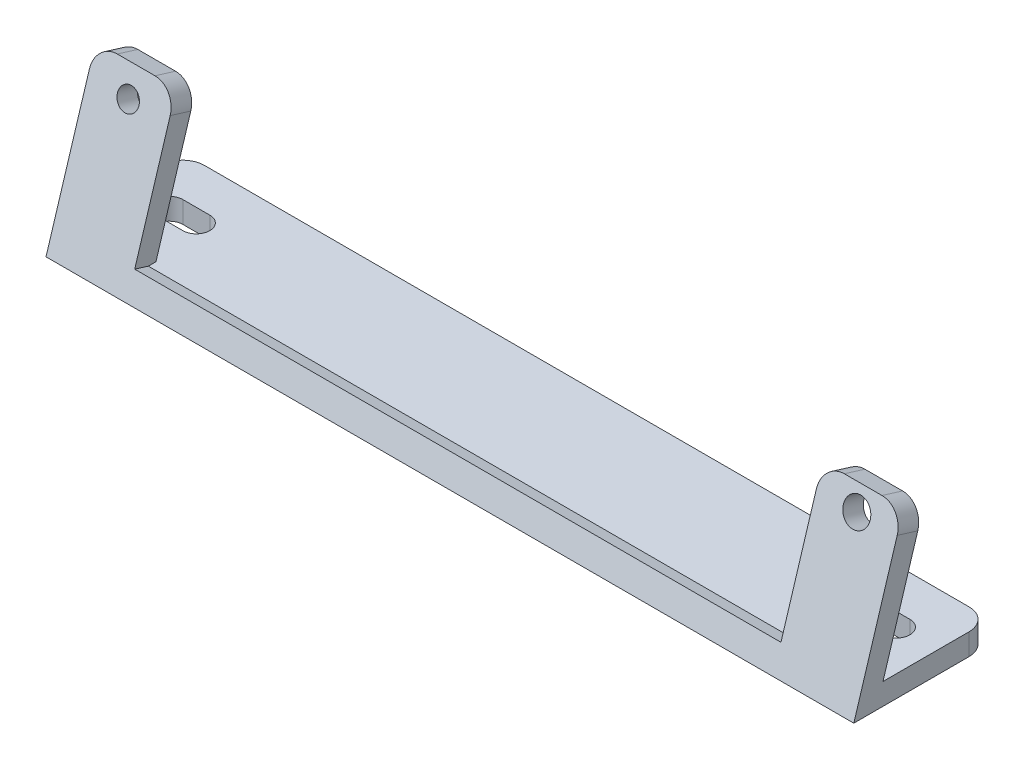
ISO-10303-21;
HEADER;
FILE_DESCRIPTION(('STEP AP214'),'2;1');
FILE_NAME('part.step','',(''),(''),'','','');
FILE_SCHEMA(('AUTOMOTIVE_DESIGN { 1 0 10303 214 1 1 1 1 }'));
ENDSEC;
DATA;
#1=APPLICATION_CONTEXT('core data for automotive mechanical design processes');
#2=APPLICATION_PROTOCOL_DEFINITION('international standard','automotive_design',2000,#1);
#3=PRODUCT_CONTEXT('',#1,'mechanical');
#4=PRODUCT('Part','Part','',(#3));
#5=PRODUCT_RELATED_PRODUCT_CATEGORY('part','',(#4));
#6=PRODUCT_DEFINITION_FORMATION('','',#4);
#7=PRODUCT_DEFINITION_CONTEXT('part definition',#1,'design');
#8=PRODUCT_DEFINITION('design','',#6,#7);
#9=PRODUCT_DEFINITION_SHAPE('','',#8);
#10=(LENGTH_UNIT() NAMED_UNIT(*) SI_UNIT(.MILLI.,.METRE.));
#11=(NAMED_UNIT(*) PLANE_ANGLE_UNIT() SI_UNIT($,.RADIAN.));
#12=(NAMED_UNIT(*) SI_UNIT($,.STERADIAN.) SOLID_ANGLE_UNIT());
#13=UNCERTAINTY_MEASURE_WITH_UNIT(LENGTH_MEASURE(1.E-05),#10,'distance_accuracy_value','');
#14=(GEOMETRIC_REPRESENTATION_CONTEXT(3) GLOBAL_UNCERTAINTY_ASSIGNED_CONTEXT((#13)) GLOBAL_UNIT_ASSIGNED_CONTEXT((#10,
#11,#12)) REPRESENTATION_CONTEXT('',''));
#15=CARTESIAN_POINT('',(0.,0.,0.));
#16=DIRECTION('',(0.,0.,1.));
#17=DIRECTION('',(1.,0.,0.));
#18=AXIS2_PLACEMENT_3D('',#15,#16,#17);
#19=CARTESIAN_POINT('',(-107.718631509355,30.,6.18161929623059));
#20=DIRECTION('',(0.,0.95574168052294,-0.294207138103728));
#21=DIRECTION('',(0.,0.294207138103728,0.95574168052294));
#22=AXIS2_PLACEMENT_3D('',#19,#20,#21);
#23=PLANE('',#22);
#24=DIRECTION('',(1.,0.,0.));
#25=VECTOR('',#24,1.);
#26=CARTESIAN_POINT('',(-107.718631509355,28.8231714475851,2.35865257413883));
#27=LINE('',#26,#25);
#28=CARTESIAN_POINT('',(-71.,28.8231714475851,2.35865257413883));
#29=VERTEX_POINT('',#28);
#30=CARTESIAN_POINT('',(-64.,28.8231714475851,2.35865257413883));
#31=VERTEX_POINT('',#30);
#32=EDGE_CURVE('E354',#29,#31,#27,.T.);
#33=ORIENTED_EDGE('',*,*,#32,.F.);
#34=DIRECTION('',(0.,-0.294207138103728,-0.95574168052294));
#35=VECTOR('',#34,1.);
#36=CARTESIAN_POINT('',(-71.,30.,6.18161929623059));
#37=LINE('',#36,#35);
#38=CARTESIAN_POINT('',(-71.,30.,6.18161929623059));
#39=VERTEX_POINT('',#38);
#40=EDGE_CURVE('E48',#29,#39,#37,.F.);
#41=ORIENTED_EDGE('',*,*,#40,.T.);
#42=DIRECTION('',(1.,0.,0.));
#43=VECTOR('',#42,1.);
#44=CARTESIAN_POINT('',(-107.718631509355,30.,6.18161929623059));
#45=LINE('',#44,#43);
#46=CARTESIAN_POINT('',(-64.,30.,6.18161929623059));
#47=VERTEX_POINT('',#46);
#48=EDGE_CURVE('E349',#39,#47,#45,.T.);
#49=ORIENTED_EDGE('',*,*,#48,.T.);
#50=DIRECTION('',(0.,0.294207138103728,0.95574168052294));
#51=VECTOR('',#50,1.);
#52=CARTESIAN_POINT('',(-64.,28.8231714475851,2.35865257413883));
#53=LINE('',#52,#51);
#54=EDGE_CURVE('E471',#47,#31,#53,.F.);
#55=ORIENTED_EDGE('',*,*,#54,.T.);
#56=EDGE_LOOP('',(#33,#41,#49,#55));
#57=FACE_BOUND('',#56,.T.);
#58=ADVANCED_FACE('F39',(#57),#23,.T.);
#59=CARTESIAN_POINT('',(-107.718631509355,28.8231714475851,2.35865257413883));
#60=DIRECTION('',(0.,-0.294207138103729,-0.95574168052294));
#61=DIRECTION('',(0.,0.95574168052294,-0.294207138103729));
#62=AXIS2_PLACEMENT_3D('',#59,#60,#61);
#63=PLANE('',#62);
#64=CARTESIAN_POINT('',(-67.5,24.0444630449704,3.82968826465747));
#65=DIRECTION('',(0.,-0.294207138103729,-0.95574168052294));
#66=DIRECTION('',(0.,0.95574168052294,-0.294207138103729));
#67=AXIS2_PLACEMENT_3D('',#64,#65,#66);
#68=CIRCLE('',#67,2.005);
#69=CARTESIAN_POINT('',(-67.5,25.9607251144189,3.23980295275949));
#70=VERTEX_POINT('',#69);
#71=EDGE_CURVE('E329',#70,#70,#68,.T.);
#72=ORIENTED_EDGE('',*,*,#71,.F.);
#73=EDGE_LOOP('',(#72));
#74=FACE_BOUND('',#73,.T.);
#75=DIRECTION('',(0.,-0.95574168052294,0.294207138103729));
#76=VECTOR('',#75,1.);
#77=CARTESIAN_POINT('',(-75.,28.8231714475851,2.35865257413883));
#78=LINE('',#77,#76);
#79=CARTESIAN_POINT('',(-75.,25.0002047254933,3.53548112655374));
#80=VERTEX_POINT('',#79);
#81=CARTESIAN_POINT('',(-75.,4.,10.));
#82=VERTEX_POINT('',#81);
#83=EDGE_CURVE('E335',#80,#82,#78,.T.);
#84=ORIENTED_EDGE('',*,*,#83,.F.);
#85=CARTESIAN_POINT('',(-71.,25.0002047254933,3.53548112655374));
#86=DIRECTION('',(0.,-0.294207138103729,-0.95574168052294));
#87=DIRECTION('',(0.,0.95574168052294,-0.294207138103729));
#88=AXIS2_PLACEMENT_3D('',#85,#86,#87);
#89=CIRCLE('',#88,4.);
#90=EDGE_CURVE('E468',#80,#29,#89,.T.);
#91=ORIENTED_EDGE('',*,*,#90,.T.);
#92=ORIENTED_EDGE('',*,*,#32,.T.);
#93=CARTESIAN_POINT('',(-64.,25.0002047254933,3.53548112655374));
#94=DIRECTION('',(0.,-0.294207138103729,-0.95574168052294));
#95=DIRECTION('',(0.,0.95574168052294,-0.294207138103729));
#96=AXIS2_PLACEMENT_3D('',#93,#94,#95);
#97=CIRCLE('',#96,4.);
#98=CARTESIAN_POINT('',(-60.,25.0002047254933,3.53548112655374));
#99=VERTEX_POINT('',#98);
#100=EDGE_CURVE('E465',#31,#99,#97,.T.);
#101=ORIENTED_EDGE('',*,*,#100,.T.);
#102=DIRECTION('',(0.,0.95574168052294,-0.294207138103729));
#103=VECTOR('',#102,1.);
#104=CARTESIAN_POINT('',(-60.,28.8231714475851,2.35865257413883));
#105=LINE('',#104,#103);
#106=CARTESIAN_POINT('',(-60.,4.,10.));
#107=VERTEX_POINT('',#106);
#108=EDGE_CURVE('E392',#107,#99,#105,.T.);
#109=ORIENTED_EDGE('',*,*,#108,.F.);
#110=DIRECTION('',(1.,0.,0.));
#111=VECTOR('',#110,1.);
#112=CARTESIAN_POINT('',(-75.,4.,10.));
#113=LINE('',#112,#111);
#114=EDGE_CURVE('E375',#82,#107,#113,.T.);
#115=ORIENTED_EDGE('',*,*,#114,.F.);
#116=EDGE_LOOP('',(#84,#91,#92,#101,#109,#115));
#117=FACE_BOUND('',#116,.T.);
#118=ADVANCED_FACE('F494',(#74,#117),#63,.T.);
#119=CARTESIAN_POINT('',(0.,4.,0.));
#120=DIRECTION('',(0.,1.,0.));
#121=DIRECTION('',(0.,0.,1.));
#122=AXIS2_PLACEMENT_3D('',#119,#120,#121);
#123=PLANE('',#122);
#124=CARTESIAN_POINT('',(-62.5,4.,0.));
#125=DIRECTION('',(0.,1.,0.));
#126=DIRECTION('',(0.,0.,1.));
#127=AXIS2_PLACEMENT_3D('',#124,#125,#126);
#128=CIRCLE('',#127,2.5);
#129=CARTESIAN_POINT('',(-62.5,4.,2.5));
#130=VERTEX_POINT('',#129);
#131=CARTESIAN_POINT('',(-62.5,4.,-2.5));
#132=VERTEX_POINT('',#131);
#133=EDGE_CURVE('E291',#130,#132,#128,.T.);
#134=ORIENTED_EDGE('',*,*,#133,.F.);
#135=DIRECTION('',(1.,0.,0.));
#136=VECTOR('',#135,1.);
#137=CARTESIAN_POINT('',(0.,4.,2.50000000000002));
#138=LINE('',#137,#136);
#139=CARTESIAN_POINT('',(-67.5,4.,2.5));
#140=VERTEX_POINT('',#139);
#141=EDGE_CURVE('E283',#140,#130,#138,.T.);
#142=ORIENTED_EDGE('',*,*,#141,.F.);
#143=CARTESIAN_POINT('',(-67.5,4.,0.));
#144=DIRECTION('',(0.,1.,0.));
#145=DIRECTION('',(0.,0.,1.));
#146=AXIS2_PLACEMENT_3D('',#143,#144,#145);
#147=CIRCLE('',#146,2.5);
#148=CARTESIAN_POINT('',(-67.5,4.,-2.5));
#149=VERTEX_POINT('',#148);
#150=EDGE_CURVE('E212',#149,#140,#147,.T.);
#151=ORIENTED_EDGE('',*,*,#150,.F.);
#152=DIRECTION('',(-1.,0.,0.));
#153=VECTOR('',#152,1.);
#154=CARTESIAN_POINT('',(0.,4.,-2.49999999999999));
#155=LINE('',#154,#153);
#156=EDGE_CURVE('E288',#132,#149,#155,.T.);
#157=ORIENTED_EDGE('',*,*,#156,.F.);
#158=EDGE_LOOP('',(#134,#142,#151,#157));
#159=FACE_BOUND('',#158,.T.);
#160=CARTESIAN_POINT('',(62.5,4.,0.));
#161=DIRECTION('',(0.,1.,0.));
#162=DIRECTION('',(0.,0.,1.));
#163=AXIS2_PLACEMENT_3D('',#160,#161,#162);
#164=CIRCLE('',#163,2.5);
#165=CARTESIAN_POINT('',(62.5,4.,-2.5));
#166=VERTEX_POINT('',#165);
#167=CARTESIAN_POINT('',(62.5,4.,2.5));
#168=VERTEX_POINT('',#167);
#169=EDGE_CURVE('E280',#166,#168,#164,.T.);
#170=ORIENTED_EDGE('',*,*,#169,.F.);
#171=DIRECTION('',(-1.,0.,0.));
#172=VECTOR('',#171,1.);
#173=CARTESIAN_POINT('',(0.,4.,-2.50000000000001));
#174=LINE('',#173,#172);
#175=CARTESIAN_POINT('',(67.5,4.,-2.5));
#176=VERTEX_POINT('',#175);
#177=EDGE_CURVE('E241',#176,#166,#174,.T.);
#178=ORIENTED_EDGE('',*,*,#177,.F.);
#179=CARTESIAN_POINT('',(67.5,4.,0.));
#180=DIRECTION('',(0.,1.,0.));
#181=DIRECTION('',(0.,0.,1.));
#182=AXIS2_PLACEMENT_3D('',#179,#180,#181);
#183=CIRCLE('',#182,2.5);
#184=CARTESIAN_POINT('',(67.5,4.,2.5));
#185=VERTEX_POINT('',#184);
#186=EDGE_CURVE('E274',#185,#176,#183,.T.);
#187=ORIENTED_EDGE('',*,*,#186,.F.);
#188=DIRECTION('',(1.,0.,0.));
#189=VECTOR('',#188,1.);
#190=CARTESIAN_POINT('',(0.,4.,2.49999999999999));
#191=LINE('',#190,#189);
#192=EDGE_CURVE('E277',#168,#185,#191,.T.);
#193=ORIENTED_EDGE('',*,*,#192,.F.);
#194=EDGE_LOOP('',(#170,#178,#187,#193));
#195=FACE_BOUND('',#194,.T.);
#196=CARTESIAN_POINT('',(-71.,4.,-6.));
#197=DIRECTION('',(0.,1.,0.));
#198=DIRECTION('',(0.,0.,1.));
#199=AXIS2_PLACEMENT_3D('',#196,#197,#198);
#200=CIRCLE('',#199,4.);
#201=CARTESIAN_POINT('',(-71.,4.,-10.));
#202=VERTEX_POINT('',#201);
#203=CARTESIAN_POINT('',(-75.,4.,-6.));
#204=VERTEX_POINT('',#203);
#205=EDGE_CURVE('E426',#202,#204,#200,.T.);
#206=ORIENTED_EDGE('',*,*,#205,.T.);
#207=DIRECTION('',(0.,0.,1.));
#208=VECTOR('',#207,1.);
#209=CARTESIAN_POINT('',(-75.,4.,-10.));
#210=LINE('',#209,#208);
#211=EDGE_CURVE('E371',#204,#82,#210,.T.);
#212=ORIENTED_EDGE('',*,*,#211,.T.);
#213=ORIENTED_EDGE('',*,*,#114,.T.);
#214=DIRECTION('',(0.,0.,-1.));
#215=VECTOR('',#214,1.);
#216=CARTESIAN_POINT('',(-60.,4.,-3.37579750899881));
#217=LINE('',#216,#215);
#218=CARTESIAN_POINT('',(-60.,4.,11.4158603734888));
#219=VERTEX_POINT('',#218);
#220=EDGE_CURVE('E294',#219,#107,#217,.T.);
#221=ORIENTED_EDGE('',*,*,#220,.F.);
#222=DIRECTION('',(-1.,0.,0.));
#223=VECTOR('',#222,1.);
#224=CARTESIAN_POINT('',(-60.,4.,11.4158603734888));
#225=LINE('',#224,#223);
#226=CARTESIAN_POINT('',(60.,4.,11.4158603734888));
#227=VERTEX_POINT('',#226);
#228=EDGE_CURVE('E300',#227,#219,#225,.T.);
#229=ORIENTED_EDGE('',*,*,#228,.F.);
#230=DIRECTION('',(0.,0.,1.));
#231=VECTOR('',#230,1.);
#232=CARTESIAN_POINT('',(60.,4.,-3.37579750899881));
#233=LINE('',#232,#231);
#234=CARTESIAN_POINT('',(60.,4.,10.));
#235=VERTEX_POINT('',#234);
#236=EDGE_CURVE('E295',#235,#227,#233,.T.);
#237=ORIENTED_EDGE('',*,*,#236,.F.);
#238=CARTESIAN_POINT('',(75.,4.,10.));
#239=VERTEX_POINT('',#238);
#240=EDGE_CURVE('E374',#235,#239,#113,.T.);
#241=ORIENTED_EDGE('',*,*,#240,.T.);
#242=DIRECTION('',(0.,0.,-1.));
#243=VECTOR('',#242,1.);
#244=CARTESIAN_POINT('',(75.,4.,-10.));
#245=LINE('',#244,#243);
#246=CARTESIAN_POINT('',(75.,4.,-6.));
#247=VERTEX_POINT('',#246);
#248=EDGE_CURVE('E362',#239,#247,#245,.T.);
#249=ORIENTED_EDGE('',*,*,#248,.T.);
#250=CARTESIAN_POINT('',(71.,4.,-6.));
#251=DIRECTION('',(0.,1.,0.));
#252=DIRECTION('',(0.,0.,1.));
#253=AXIS2_PLACEMENT_3D('',#250,#251,#252);
#254=CIRCLE('',#253,4.);
#255=CARTESIAN_POINT('',(71.,4.,-10.));
#256=VERTEX_POINT('',#255);
#257=EDGE_CURVE('E423',#247,#256,#254,.T.);
#258=ORIENTED_EDGE('',*,*,#257,.T.);
#259=DIRECTION('',(-1.,0.,0.));
#260=VECTOR('',#259,1.);
#261=CARTESIAN_POINT('',(-75.,4.,-10.));
#262=LINE('',#261,#260);
#263=EDGE_CURVE('E366',#256,#202,#262,.T.);
#264=ORIENTED_EDGE('',*,*,#263,.T.);
#265=EDGE_LOOP('',(#206,#212,#213,#221,#229,#237,#241,#249,#258,#264));
#266=FACE_BOUND('',#265,.T.);
#267=ADVANCED_FACE('F497',(#159,#195,#266),#123,.T.);
#268=CARTESIAN_POINT('',(0.,0.,0.));
#269=DIRECTION('',(0.,1.,0.));
#270=DIRECTION('',(0.,0.,1.));
#271=AXIS2_PLACEMENT_3D('',#268,#269,#270);
#272=PLANE('',#271);
#273=DIRECTION('',(-1.,0.,0.));
#274=VECTOR('',#273,1.);
#275=CARTESIAN_POINT('',(-62.5,0.,2.5));
#276=LINE('',#275,#274);
#277=CARTESIAN_POINT('',(-62.5,0.,2.5));
#278=VERTEX_POINT('',#277);
#279=CARTESIAN_POINT('',(-67.5,0.,2.5));
#280=VERTEX_POINT('',#279);
#281=EDGE_CURVE('E220',#278,#280,#276,.T.);
#282=ORIENTED_EDGE('',*,*,#281,.F.);
#283=CARTESIAN_POINT('',(-62.5,0.,0.));
#284=DIRECTION('',(0.,-1.,0.));
#285=DIRECTION('',(0.,0.,-1.));
#286=AXIS2_PLACEMENT_3D('',#283,#284,#285);
#287=CIRCLE('',#286,2.5);
#288=CARTESIAN_POINT('',(-62.5,0.,-2.5));
#289=VERTEX_POINT('',#288);
#290=EDGE_CURVE('E226',#289,#278,#287,.T.);
#291=ORIENTED_EDGE('',*,*,#290,.F.);
#292=DIRECTION('',(1.,0.,0.));
#293=VECTOR('',#292,1.);
#294=CARTESIAN_POINT('',(-62.5,0.,-2.5));
#295=LINE('',#294,#293);
#296=CARTESIAN_POINT('',(-67.5,0.,-2.5));
#297=VERTEX_POINT('',#296);
#298=EDGE_CURVE('E231',#297,#289,#295,.T.);
#299=ORIENTED_EDGE('',*,*,#298,.F.);
#300=CARTESIAN_POINT('',(-67.5,0.,0.));
#301=DIRECTION('',(0.,-1.,0.));
#302=DIRECTION('',(0.,0.,-1.));
#303=AXIS2_PLACEMENT_3D('',#300,#301,#302);
#304=CIRCLE('',#303,2.5);
#305=EDGE_CURVE('E209',#280,#297,#304,.T.);
#306=ORIENTED_EDGE('',*,*,#305,.F.);
#307=EDGE_LOOP('',(#282,#291,#299,#306));
#308=FACE_BOUND('',#307,.T.);
#309=DIRECTION('',(1.,0.,0.));
#310=VECTOR('',#309,1.);
#311=CARTESIAN_POINT('',(62.5,0.,-2.5));
#312=LINE('',#311,#310);
#313=CARTESIAN_POINT('',(62.5,0.,-2.5));
#314=VERTEX_POINT('',#313);
#315=CARTESIAN_POINT('',(67.5,0.,-2.5));
#316=VERTEX_POINT('',#315);
#317=EDGE_CURVE('E249',#314,#316,#312,.T.);
#318=ORIENTED_EDGE('',*,*,#317,.F.);
#319=CARTESIAN_POINT('',(62.5,0.,0.));
#320=DIRECTION('',(0.,-1.,0.));
#321=DIRECTION('',(0.,0.,-1.));
#322=AXIS2_PLACEMENT_3D('',#319,#320,#321);
#323=CIRCLE('',#322,2.5);
#324=CARTESIAN_POINT('',(62.5,0.,2.5));
#325=VERTEX_POINT('',#324);
#326=EDGE_CURVE('E246',#325,#314,#323,.T.);
#327=ORIENTED_EDGE('',*,*,#326,.F.);
#328=DIRECTION('',(-1.,0.,0.));
#329=VECTOR('',#328,1.);
#330=CARTESIAN_POINT('',(62.5,0.,2.5));
#331=LINE('',#330,#329);
#332=CARTESIAN_POINT('',(67.5,0.,2.5));
#333=VERTEX_POINT('',#332);
#334=EDGE_CURVE('E256',#333,#325,#331,.T.);
#335=ORIENTED_EDGE('',*,*,#334,.F.);
#336=CARTESIAN_POINT('',(67.5,0.,0.));
#337=DIRECTION('',(0.,-1.,0.));
#338=DIRECTION('',(0.,0.,-1.));
#339=AXIS2_PLACEMENT_3D('',#336,#337,#338);
#340=CIRCLE('',#339,2.5);
#341=EDGE_CURVE('E252',#316,#333,#340,.T.);
#342=ORIENTED_EDGE('',*,*,#341,.F.);
#343=EDGE_LOOP('',(#318,#327,#335,#342));
#344=FACE_BOUND('',#343,.T.);
#345=CARTESIAN_POINT('',(71.,0.,-6.));
#346=DIRECTION('',(0.,1.,0.));
#347=DIRECTION('',(0.,0.,1.));
#348=AXIS2_PLACEMENT_3D('',#345,#346,#347);
#349=CIRCLE('',#348,4.);
#350=CARTESIAN_POINT('',(71.,0.,-10.));
#351=VERTEX_POINT('',#350);
#352=CARTESIAN_POINT('',(75.,0.,-6.));
#353=VERTEX_POINT('',#352);
#354=EDGE_CURVE('E410',#351,#353,#349,.F.);
#355=ORIENTED_EDGE('',*,*,#354,.T.);
#356=DIRECTION('',(0.,0.,-1.));
#357=VECTOR('',#356,1.);
#358=CARTESIAN_POINT('',(75.,0.,-10.));
#359=LINE('',#358,#357);
#360=CARTESIAN_POINT('',(75.,0.,15.4165562284386));
#361=VERTEX_POINT('',#360);
#362=EDGE_CURVE('E361',#361,#353,#359,.T.);
#363=ORIENTED_EDGE('',*,*,#362,.F.);
#364=DIRECTION('',(1.,0.,0.));
#365=VECTOR('',#364,1.);
#366=CARTESIAN_POINT('',(-107.718631509355,0.,15.4165562284386));
#367=LINE('',#366,#365);
#368=CARTESIAN_POINT('',(-75.,0.,15.4165562284386));
#369=VERTEX_POINT('',#368);
#370=EDGE_CURVE('E336',#369,#361,#367,.T.);
#371=ORIENTED_EDGE('',*,*,#370,.F.);
#372=DIRECTION('',(0.,0.,1.));
#373=VECTOR('',#372,1.);
#374=CARTESIAN_POINT('',(-75.,0.,-10.));
#375=LINE('',#374,#373);
#376=CARTESIAN_POINT('',(-75.,0.,-6.));
#377=VERTEX_POINT('',#376);
#378=EDGE_CURVE('E367',#377,#369,#375,.T.);
#379=ORIENTED_EDGE('',*,*,#378,.F.);
#380=CARTESIAN_POINT('',(-71.,0.,-6.));
#381=DIRECTION('',(0.,1.,0.));
#382=DIRECTION('',(0.,0.,1.));
#383=AXIS2_PLACEMENT_3D('',#380,#381,#382);
#384=CIRCLE('',#383,4.);
#385=CARTESIAN_POINT('',(-71.,0.,-10.));
#386=VERTEX_POINT('',#385);
#387=EDGE_CURVE('E413',#377,#386,#384,.F.);
#388=ORIENTED_EDGE('',*,*,#387,.T.);
#389=DIRECTION('',(-1.,0.,0.));
#390=VECTOR('',#389,1.);
#391=CARTESIAN_POINT('',(-75.,0.,-10.));
#392=LINE('',#391,#390);
#393=EDGE_CURVE('E383',#351,#386,#392,.T.);
#394=ORIENTED_EDGE('',*,*,#393,.F.);
#395=EDGE_LOOP('',(#355,#363,#371,#379,#388,#394));
#396=FACE_BOUND('',#395,.T.);
#397=ADVANCED_FACE('F228',(#308,#344,#396),#272,.F.);
#398=CARTESIAN_POINT('',(75.,4.,-10.));
#399=DIRECTION('',(-1.,0.,0.));
#400=DIRECTION('',(0.,0.,1.));
#401=AXIS2_PLACEMENT_3D('',#398,#399,#400);
#402=PLANE('',#401);
#403=DIRECTION('',(0.,-0.95574168052294,0.294207138103729));
#404=VECTOR('',#403,1.);
#405=CARTESIAN_POINT('',(75.,0.,15.4165562284386));
#406=LINE('',#405,#404);
#407=CARTESIAN_POINT('',(75.,26.1770332779082,7.3584478486455));
#408=VERTEX_POINT('',#407);
#409=EDGE_CURVE('E341',#408,#361,#406,.T.);
#410=ORIENTED_EDGE('',*,*,#409,.T.);
#411=ORIENTED_EDGE('',*,*,#362,.T.);
#412=DIRECTION('',(0.,-1.,0.));
#413=VECTOR('',#412,1.);
#414=CARTESIAN_POINT('',(75.,4.,-6.));
#415=LINE('',#414,#413);
#416=EDGE_CURVE('E433',#353,#247,#415,.F.);
#417=ORIENTED_EDGE('',*,*,#416,.T.);
#418=ORIENTED_EDGE('',*,*,#248,.F.);
#419=DIRECTION('',(0.,0.95574168052294,-0.294207138103729));
#420=VECTOR('',#419,1.);
#421=CARTESIAN_POINT('',(75.,28.8231714475851,2.35865257413883));
#422=LINE('',#421,#420);
#423=CARTESIAN_POINT('',(75.,25.0002047254933,3.53548112655374));
#424=VERTEX_POINT('',#423);
#425=EDGE_CURVE('E337',#239,#424,#422,.T.);
#426=ORIENTED_EDGE('',*,*,#425,.T.);
#427=DIRECTION('',(0.,0.294207138103728,0.95574168052294));
#428=VECTOR('',#427,1.);
#429=CARTESIAN_POINT('',(75.,26.1770332779082,7.3584478486455));
#430=LINE('',#429,#428);
#431=EDGE_CURVE('E429',#424,#408,#430,.T.);
#432=ORIENTED_EDGE('',*,*,#431,.T.);
#433=EDGE_LOOP('',(#410,#411,#417,#418,#426,#432));
#434=FACE_BOUND('',#433,.T.);
#435=ADVANCED_FACE('F517',(#434),#402,.F.);
#436=CARTESIAN_POINT('',(-75.,4.,-10.));
#437=DIRECTION('',(0.,0.,1.));
#438=DIRECTION('',(1.,0.,0.));
#439=AXIS2_PLACEMENT_3D('',#436,#437,#438);
#440=PLANE('',#439);
#441=ORIENTED_EDGE('',*,*,#393,.T.);
#442=DIRECTION('',(0.,-1.,0.));
#443=VECTOR('',#442,1.);
#444=CARTESIAN_POINT('',(-71.,4.,-10.));
#445=LINE('',#444,#443);
#446=EDGE_CURVE('E420',#386,#202,#445,.F.);
#447=ORIENTED_EDGE('',*,*,#446,.T.);
#448=ORIENTED_EDGE('',*,*,#263,.F.);
#449=DIRECTION('',(0.,-1.,0.));
#450=VECTOR('',#449,1.);
#451=CARTESIAN_POINT('',(71.,4.,-10.));
#452=LINE('',#451,#450);
#453=EDGE_CURVE('E416',#256,#351,#452,.T.);
#454=ORIENTED_EDGE('',*,*,#453,.T.);
#455=EDGE_LOOP('',(#441,#447,#448,#454));
#456=FACE_BOUND('',#455,.T.);
#457=ADVANCED_FACE('F508',(#456),#440,.F.);
#458=CARTESIAN_POINT('',(-75.,4.,-10.));
#459=DIRECTION('',(1.,0.,0.));
#460=DIRECTION('',(0.,0.,-1.));
#461=AXIS2_PLACEMENT_3D('',#458,#459,#460);
#462=PLANE('',#461);
#463=ORIENTED_EDGE('',*,*,#83,.T.);
#464=ORIENTED_EDGE('',*,*,#211,.F.);
#465=DIRECTION('',(0.,-1.,0.));
#466=VECTOR('',#465,1.);
#467=CARTESIAN_POINT('',(-75.,4.,-6.));
#468=LINE('',#467,#466);
#469=EDGE_CURVE('E406',#204,#377,#468,.T.);
#470=ORIENTED_EDGE('',*,*,#469,.T.);
#471=ORIENTED_EDGE('',*,*,#378,.T.);
#472=DIRECTION('',(0.,0.95574168052294,-0.294207138103729));
#473=VECTOR('',#472,1.);
#474=CARTESIAN_POINT('',(-75.,0.,15.4165562284386));
#475=LINE('',#474,#473);
#476=CARTESIAN_POINT('',(-75.,26.1770332779082,7.3584478486455));
#477=VERTEX_POINT('',#476);
#478=EDGE_CURVE('E332',#369,#477,#475,.T.);
#479=ORIENTED_EDGE('',*,*,#478,.T.);
#480=DIRECTION('',(0.,-0.294207138103728,-0.95574168052294));
#481=VECTOR('',#480,1.);
#482=CARTESIAN_POINT('',(-75.,25.0002047254933,3.53548112655374));
#483=LINE('',#482,#481);
#484=EDGE_CURVE('E396',#477,#80,#483,.T.);
#485=ORIENTED_EDGE('',*,*,#484,.T.);
#486=EDGE_LOOP('',(#463,#464,#470,#471,#479,#485));
#487=FACE_BOUND('',#486,.T.);
#488=ADVANCED_FACE('F490',(#487),#462,.F.);
#489=CARTESIAN_POINT('',(-107.718631509355,0.,15.4165562284386));
#490=DIRECTION('',(0.,0.294207138103729,0.95574168052294));
#491=DIRECTION('',(0.,-0.95574168052294,0.294207138103729));
#492=AXIS2_PLACEMENT_3D('',#489,#490,#491);
#493=PLANE('',#492);
#494=CARTESIAN_POINT('',(-71.,26.1770332779082,7.3584478486455));
#495=DIRECTION('',(0.,0.294207138103729,0.95574168052294));
#496=DIRECTION('',(0.,-0.95574168052294,0.294207138103729));
#497=AXIS2_PLACEMENT_3D('',#494,#495,#496);
#498=CIRCLE('',#497,4.);
#499=EDGE_CURVE('E446',#39,#477,#498,.T.);
#500=ORIENTED_EDGE('',*,*,#499,.T.);
#501=ORIENTED_EDGE('',*,*,#478,.F.);
#502=ORIENTED_EDGE('',*,*,#370,.T.);
#503=ORIENTED_EDGE('',*,*,#409,.F.);
#504=CARTESIAN_POINT('',(71.,26.1770332779082,7.3584478486455));
#505=DIRECTION('',(0.,0.294207138103729,0.95574168052294));
#506=DIRECTION('',(0.,-0.95574168052294,0.294207138103729));
#507=AXIS2_PLACEMENT_3D('',#504,#505,#506);
#508=CIRCLE('',#507,4.);
#509=CARTESIAN_POINT('',(71.,30.,6.18161929623059));
#510=VERTEX_POINT('',#509);
#511=EDGE_CURVE('E450',#408,#510,#508,.T.);
#512=ORIENTED_EDGE('',*,*,#511,.T.);
#513=CARTESIAN_POINT('',(64.,30.,6.18161929623059));
#514=VERTEX_POINT('',#513);
#515=EDGE_CURVE('E353',#514,#510,#45,.T.);
#516=ORIENTED_EDGE('',*,*,#515,.F.);
#517=CARTESIAN_POINT('',(64.,26.1770332779082,7.3584478486455));
#518=DIRECTION('',(0.,0.294207138103729,0.95574168052294));
#519=DIRECTION('',(0.,-0.95574168052294,0.294207138103729));
#520=AXIS2_PLACEMENT_3D('',#517,#518,#519);
#521=CIRCLE('',#520,4.);
#522=CARTESIAN_POINT('',(60.,26.1770332779082,7.3584478486455));
#523=VERTEX_POINT('',#522);
#524=EDGE_CURVE('E453',#514,#523,#521,.T.);
#525=ORIENTED_EDGE('',*,*,#524,.T.);
#526=DIRECTION('',(0.,0.95574168052294,-0.294207138103729));
#527=VECTOR('',#526,1.);
#528=CARTESIAN_POINT('',(60.,30.,6.18161929623059));
#529=LINE('',#528,#527);
#530=CARTESIAN_POINT('',(60.,4.7787084026147,13.94552053792));
#531=VERTEX_POINT('',#530);
#532=EDGE_CURVE('E321',#531,#523,#529,.T.);
#533=ORIENTED_EDGE('',*,*,#532,.F.);
#534=DIRECTION('',(1.,0.,0.));
#535=VECTOR('',#534,1.);
#536=CARTESIAN_POINT('',(-60.,4.7787084026147,13.94552053792));
#537=LINE('',#536,#535);
#538=CARTESIAN_POINT('',(-60.,4.7787084026147,13.94552053792));
#539=VERTEX_POINT('',#538);
#540=EDGE_CURVE('E317',#539,#531,#537,.T.);
#541=ORIENTED_EDGE('',*,*,#540,.F.);
#542=DIRECTION('',(0.,-0.95574168052294,0.294207138103729));
#543=VECTOR('',#542,1.);
#544=CARTESIAN_POINT('',(-60.,30.,6.18161929623059));
#545=LINE('',#544,#543);
#546=CARTESIAN_POINT('',(-60.,26.1770332779082,7.3584478486455));
#547=VERTEX_POINT('',#546);
#548=EDGE_CURVE('E310',#547,#539,#545,.T.);
#549=ORIENTED_EDGE('',*,*,#548,.F.);
#550=CARTESIAN_POINT('',(-64.,26.1770332779082,7.3584478486455));
#551=DIRECTION('',(0.,0.294207138103729,0.95574168052294));
#552=DIRECTION('',(0.,-0.95574168052294,0.294207138103729));
#553=AXIS2_PLACEMENT_3D('',#550,#551,#552);
#554=CIRCLE('',#553,4.);
#555=EDGE_CURVE('E443',#547,#47,#554,.T.);
#556=ORIENTED_EDGE('',*,*,#555,.T.);
#557=ORIENTED_EDGE('',*,*,#48,.F.);
#558=EDGE_LOOP('',(#500,#501,#502,#503,#512,#516,#525,#533,#541,#549,#556,#557));
#559=FACE_BOUND('',#558,.T.);
#560=CARTESIAN_POINT('',(67.5,26.167475861103,7.36138992002654));
#561=DIRECTION('',(0.,0.294207138103729,0.95574168052294));
#562=DIRECTION('',(0.,-0.95574168052294,0.294207138103729));
#563=AXIS2_PLACEMENT_3D('',#560,#561,#562);
#564=CIRCLE('',#563,2.5);
#565=CARTESIAN_POINT('',(67.5,23.7781216597957,8.09690776528586));
#566=VERTEX_POINT('',#565);
#567=EDGE_CURVE('E299',#566,#566,#564,.T.);
#568=ORIENTED_EDGE('',*,*,#567,.F.);
#569=EDGE_LOOP('',(#568));
#570=FACE_BOUND('',#569,.T.);
#571=CARTESIAN_POINT('',(-67.5,25.2212915973853,7.65265498674923));
#572=DIRECTION('',(0.,0.294207138103729,0.95574168052294));
#573=DIRECTION('',(0.,-0.95574168052294,0.294207138103729));
#574=AXIS2_PLACEMENT_3D('',#571,#572,#573);
#575=CIRCLE('',#574,2.005);
#576=CARTESIAN_POINT('',(-67.5,23.3050295279368,8.24254029864721));
#577=VERTEX_POINT('',#576);
#578=EDGE_CURVE('E306',#577,#577,#575,.T.);
#579=ORIENTED_EDGE('',*,*,#578,.F.);
#580=EDGE_LOOP('',(#579));
#581=FACE_BOUND('',#580,.T.);
#582=ADVANCED_FACE('F482',(#559,#570,#581),#493,.T.);
#583=CARTESIAN_POINT('',(64.,28.8231714475851,2.35865257413883));
#584=VERTEX_POINT('',#583);
#585=CARTESIAN_POINT('',(71.,28.8231714475851,2.35865257413883));
#586=VERTEX_POINT('',#585);
#587=EDGE_CURVE('E345',#584,#586,#27,.T.);
#588=ORIENTED_EDGE('',*,*,#587,.F.);
#589=DIRECTION('',(0.,0.294207138103728,0.95574168052294));
#590=VECTOR('',#589,1.);
#591=CARTESIAN_POINT('',(64.,30.,6.18161929623059));
#592=LINE('',#591,#590);
#593=EDGE_CURVE('E439',#584,#514,#592,.T.);
#594=ORIENTED_EDGE('',*,*,#593,.T.);
#595=ORIENTED_EDGE('',*,*,#515,.T.);
#596=DIRECTION('',(0.,0.294207138103728,0.95574168052294));
#597=VECTOR('',#596,1.);
#598=CARTESIAN_POINT('',(71.,28.8231714475851,2.35865257413883));
#599=LINE('',#598,#597);
#600=EDGE_CURVE('E436',#510,#586,#599,.F.);
#601=ORIENTED_EDGE('',*,*,#600,.T.);
#602=EDGE_LOOP('',(#588,#594,#595,#601));
#603=FACE_BOUND('',#602,.T.);
#604=ADVANCED_FACE('F527',(#603),#23,.T.);
#605=CARTESIAN_POINT('',(67.5,24.9906473086881,3.53842319793478));
#606=DIRECTION('',(0.,-0.294207138103729,-0.95574168052294));
#607=DIRECTION('',(0.,0.95574168052294,-0.294207138103729));
#608=AXIS2_PLACEMENT_3D('',#605,#606,#607);
#609=CIRCLE('',#608,2.5);
#610=CARTESIAN_POINT('',(67.5,27.3800015099954,2.80290535267546));
#611=VERTEX_POINT('',#610);
#612=EDGE_CURVE('E342',#611,#611,#609,.T.);
#613=ORIENTED_EDGE('',*,*,#612,.F.);
#614=EDGE_LOOP('',(#613));
#615=FACE_BOUND('',#614,.T.);
#616=DIRECTION('',(0.,-0.95574168052294,0.294207138103729));
#617=VECTOR('',#616,1.);
#618=CARTESIAN_POINT('',(60.,28.8231714475851,2.35865257413883));
#619=LINE('',#618,#617);
#620=CARTESIAN_POINT('',(60.,25.0002047254933,3.53548112655374));
#621=VERTEX_POINT('',#620);
#622=EDGE_CURVE('E379',#621,#235,#619,.T.);
#623=ORIENTED_EDGE('',*,*,#622,.F.);
#624=CARTESIAN_POINT('',(64.,25.0002047254933,3.53548112655374));
#625=DIRECTION('',(0.,-0.294207138103729,-0.95574168052294));
#626=DIRECTION('',(0.,0.95574168052294,-0.294207138103729));
#627=AXIS2_PLACEMENT_3D('',#624,#625,#626);
#628=CIRCLE('',#627,4.);
#629=EDGE_CURVE('E462',#621,#584,#628,.T.);
#630=ORIENTED_EDGE('',*,*,#629,.T.);
#631=ORIENTED_EDGE('',*,*,#587,.T.);
#632=CARTESIAN_POINT('',(71.,25.0002047254933,3.53548112655374));
#633=DIRECTION('',(0.,-0.294207138103729,-0.95574168052294));
#634=DIRECTION('',(0.,0.95574168052294,-0.294207138103729));
#635=AXIS2_PLACEMENT_3D('',#632,#633,#634);
#636=CIRCLE('',#635,4.);
#637=EDGE_CURVE('E459',#586,#424,#636,.T.);
#638=ORIENTED_EDGE('',*,*,#637,.T.);
#639=ORIENTED_EDGE('',*,*,#425,.F.);
#640=ORIENTED_EDGE('',*,*,#240,.F.);
#641=EDGE_LOOP('',(#623,#630,#631,#638,#639,#640));
#642=FACE_BOUND('',#641,.T.);
#643=ADVANCED_FACE('F536',(#615,#642),#63,.T.);
#644=CARTESIAN_POINT('',(-60.,27.0579286189627,-3.37579750899881));
#645=DIRECTION('',(-1.,0.,0.));
#646=DIRECTION('',(0.,0.,1.));
#647=AXIS2_PLACEMENT_3D('',#644,#645,#646);
#648=PLANE('',#647);
#649=DIRECTION('',(0.,0.294207138103729,0.95574168052294));
#650=VECTOR('',#649,1.);
#651=CARTESIAN_POINT('',(-60.,1.83663702157741,4.38810373269057));
#652=LINE('',#651,#650);
#653=EDGE_CURVE('E325',#219,#539,#652,.T.);
#654=ORIENTED_EDGE('',*,*,#653,.F.);
#655=ORIENTED_EDGE('',*,*,#220,.T.);
#656=ORIENTED_EDGE('',*,*,#108,.T.);
#657=DIRECTION('',(0.,0.294207138103728,0.95574168052294));
#658=VECTOR('',#657,1.);
#659=CARTESIAN_POINT('',(-60.,26.1770332779082,7.3584478486455));
#660=LINE('',#659,#658);
#661=EDGE_CURVE('E11',#99,#547,#660,.T.);
#662=ORIENTED_EDGE('',*,*,#661,.T.);
#663=ORIENTED_EDGE('',*,*,#548,.T.);
#664=EDGE_LOOP('',(#654,#655,#656,#662,#663));
#665=FACE_BOUND('',#664,.T.);
#666=ADVANCED_FACE('F553',(#665),#648,.F.);
#667=CARTESIAN_POINT('',(60.,27.0579286189627,-3.37579750899881));
#668=DIRECTION('',(1.,0.,0.));
#669=DIRECTION('',(0.,0.,-1.));
#670=AXIS2_PLACEMENT_3D('',#667,#668,#669);
#671=PLANE('',#670);
#672=ORIENTED_EDGE('',*,*,#622,.T.);
#673=ORIENTED_EDGE('',*,*,#236,.T.);
#674=DIRECTION('',(0.,0.294207138103729,0.95574168052294));
#675=VECTOR('',#674,1.);
#676=CARTESIAN_POINT('',(60.,1.83663702157741,4.38810373269057));
#677=LINE('',#676,#675);
#678=EDGE_CURVE('E326',#227,#531,#677,.T.);
#679=ORIENTED_EDGE('',*,*,#678,.T.);
#680=ORIENTED_EDGE('',*,*,#532,.T.);
#681=DIRECTION('',(0.,0.294207138103728,0.95574168052294));
#682=VECTOR('',#681,1.);
#683=CARTESIAN_POINT('',(60.,25.0002047254933,3.53548112655374));
#684=LINE('',#683,#682);
#685=EDGE_CURVE('E456',#523,#621,#684,.F.);
#686=ORIENTED_EDGE('',*,*,#685,.T.);
#687=EDGE_LOOP('',(#672,#673,#679,#680,#686));
#688=FACE_BOUND('',#687,.T.);
#689=ADVANCED_FACE('F547',(#688),#671,.F.);
#690=CARTESIAN_POINT('',(-60.,1.83663702157741,4.38810373269057));
#691=DIRECTION('',(0.,-0.95574168052294,0.294207138103729));
#692=DIRECTION('',(0.,-0.294207138103729,-0.95574168052294));
#693=AXIS2_PLACEMENT_3D('',#690,#691,#692);
#694=PLANE('',#693);
#695=ORIENTED_EDGE('',*,*,#678,.F.);
#696=ORIENTED_EDGE('',*,*,#228,.T.);
#697=ORIENTED_EDGE('',*,*,#653,.T.);
#698=ORIENTED_EDGE('',*,*,#540,.T.);
#699=EDGE_LOOP('',(#695,#696,#697,#698));
#700=FACE_BOUND('',#699,.T.);
#701=ADVANCED_FACE('F550',(#700),#694,.F.);
#702=CARTESIAN_POINT('',(-67.5,22.279220216348,-1.90476181848017));
#703=DIRECTION('',(0.,0.294207138103729,0.95574168052294));
#704=DIRECTION('',(0.,-0.95574168052294,0.294207138103729));
#705=AXIS2_PLACEMENT_3D('',#702,#703,#704);
#706=CYLINDRICAL_SURFACE('',#705,2.005);
#707=ORIENTED_EDGE('',*,*,#71,.T.);
#708=EDGE_LOOP('',(#707));
#709=FACE_BOUND('',#708,.T.);
#710=ORIENTED_EDGE('',*,*,#578,.T.);
#711=EDGE_LOOP('',(#710));
#712=FACE_BOUND('',#711,.T.);
#713=ADVANCED_FACE('F589',(#709,#712),#706,.F.);
#714=CARTESIAN_POINT('',(67.5,23.2254044800657,-2.19602688520286));
#715=DIRECTION('',(0.,0.294207138103729,0.95574168052294));
#716=DIRECTION('',(0.,-0.95574168052294,0.294207138103729));
#717=AXIS2_PLACEMENT_3D('',#714,#715,#716);
#718=CYLINDRICAL_SURFACE('',#717,2.5);
#719=ORIENTED_EDGE('',*,*,#612,.T.);
#720=EDGE_LOOP('',(#719));
#721=FACE_BOUND('',#720,.T.);
#722=ORIENTED_EDGE('',*,*,#567,.T.);
#723=EDGE_LOOP('',(#722));
#724=FACE_BOUND('',#723,.T.);
#725=ADVANCED_FACE('F592',(#721,#724),#718,.F.);
#726=CARTESIAN_POINT('',(-71.,4.,-6.));
#727=DIRECTION('',(0.,-1.,0.));
#728=DIRECTION('',(0.,0.,-1.));
#729=AXIS2_PLACEMENT_3D('',#726,#727,#728);
#730=CYLINDRICAL_SURFACE('',#729,4.);
#731=ORIENTED_EDGE('',*,*,#205,.F.);
#732=ORIENTED_EDGE('',*,*,#446,.F.);
#733=ORIENTED_EDGE('',*,*,#387,.F.);
#734=ORIENTED_EDGE('',*,*,#469,.F.);
#735=EDGE_LOOP('',(#731,#732,#733,#734));
#736=FACE_BOUND('',#735,.T.);
#737=ADVANCED_FACE('F502',(#736),#730,.T.);
#738=CARTESIAN_POINT('',(71.,4.,-6.));
#739=DIRECTION('',(0.,-1.,0.));
#740=DIRECTION('',(0.,0.,-1.));
#741=AXIS2_PLACEMENT_3D('',#738,#739,#740);
#742=CYLINDRICAL_SURFACE('',#741,4.);
#743=ORIENTED_EDGE('',*,*,#257,.F.);
#744=ORIENTED_EDGE('',*,*,#416,.F.);
#745=ORIENTED_EDGE('',*,*,#354,.F.);
#746=ORIENTED_EDGE('',*,*,#453,.F.);
#747=EDGE_LOOP('',(#743,#744,#745,#746));
#748=FACE_BOUND('',#747,.T.);
#749=ADVANCED_FACE('F513',(#748),#742,.T.);
#750=CARTESIAN_POINT('',(64.,26.1770332779082,7.3584478486455));
#751=DIRECTION('',(0.,-0.294207138103728,-0.95574168052294));
#752=DIRECTION('',(0.,0.95574168052294,-0.294207138103728));
#753=AXIS2_PLACEMENT_3D('',#750,#751,#752);
#754=CYLINDRICAL_SURFACE('',#753,4.);
#755=ORIENTED_EDGE('',*,*,#629,.F.);
#756=ORIENTED_EDGE('',*,*,#685,.F.);
#757=ORIENTED_EDGE('',*,*,#524,.F.);
#758=ORIENTED_EDGE('',*,*,#593,.F.);
#759=EDGE_LOOP('',(#755,#756,#757,#758));
#760=FACE_BOUND('',#759,.T.);
#761=ADVANCED_FACE('F544',(#760),#754,.T.);
#762=CARTESIAN_POINT('',(71.,19.3764842336313,-14.7333620712225));
#763=DIRECTION('',(0.,-0.294207138103728,-0.95574168052294));
#764=DIRECTION('',(0.,0.95574168052294,-0.294207138103728));
#765=AXIS2_PLACEMENT_3D('',#762,#763,#764);
#766=CYLINDRICAL_SURFACE('',#765,4.);
#767=ORIENTED_EDGE('',*,*,#637,.F.);
#768=ORIENTED_EDGE('',*,*,#600,.F.);
#769=ORIENTED_EDGE('',*,*,#511,.F.);
#770=ORIENTED_EDGE('',*,*,#431,.F.);
#771=EDGE_LOOP('',(#767,#768,#769,#770));
#772=FACE_BOUND('',#771,.T.);
#773=ADVANCED_FACE('F532',(#772),#766,.T.);
#774=CARTESIAN_POINT('',(-71.,19.3764842336313,-14.7333620712225));
#775=DIRECTION('',(0.,0.294207138103728,0.95574168052294));
#776=DIRECTION('',(0.,-0.95574168052294,0.294207138103728));
#777=AXIS2_PLACEMENT_3D('',#774,#775,#776);
#778=CYLINDRICAL_SURFACE('',#777,4.);
#779=ORIENTED_EDGE('',*,*,#499,.F.);
#780=ORIENTED_EDGE('',*,*,#40,.F.);
#781=ORIENTED_EDGE('',*,*,#90,.F.);
#782=ORIENTED_EDGE('',*,*,#484,.F.);
#783=EDGE_LOOP('',(#779,#780,#781,#782));
#784=FACE_BOUND('',#783,.T.);
#785=ADVANCED_FACE('F487',(#784),#778,.T.);
#786=CARTESIAN_POINT('',(-64.,23.234961896871,-2.1989689565839));
#787=DIRECTION('',(0.,-0.294207138103728,-0.95574168052294));
#788=DIRECTION('',(0.,0.95574168052294,-0.294207138103728));
#789=AXIS2_PLACEMENT_3D('',#786,#787,#788);
#790=CYLINDRICAL_SURFACE('',#789,4.);
#791=ORIENTED_EDGE('',*,*,#100,.F.);
#792=ORIENTED_EDGE('',*,*,#54,.F.);
#793=ORIENTED_EDGE('',*,*,#555,.F.);
#794=ORIENTED_EDGE('',*,*,#661,.F.);
#795=EDGE_LOOP('',(#791,#792,#793,#794));
#796=FACE_BOUND('',#795,.T.);
#797=ADVANCED_FACE('F41',(#796),#790,.T.);
#798=CARTESIAN_POINT('',(62.5,10.,0.));
#799=DIRECTION('',(0.,-1.,0.));
#800=DIRECTION('',(0.,0.,-1.));
#801=AXIS2_PLACEMENT_3D('',#798,#799,#800);
#802=CYLINDRICAL_SURFACE('',#801,2.5);
#803=ORIENTED_EDGE('',*,*,#169,.T.);
#804=DIRECTION('',(0.,-1.,0.));
#805=VECTOR('',#804,1.);
#806=CARTESIAN_POINT('',(62.5,10.,2.5));
#807=LINE('',#806,#805);
#808=EDGE_CURVE('E261',#168,#325,#807,.T.);
#809=ORIENTED_EDGE('',*,*,#808,.T.);
#810=ORIENTED_EDGE('',*,*,#326,.T.);
#811=DIRECTION('',(0.,-1.,0.));
#812=VECTOR('',#811,1.);
#813=CARTESIAN_POINT('',(62.5,10.,-2.5));
#814=LINE('',#813,#812);
#815=EDGE_CURVE('E260',#166,#314,#814,.T.);
#816=ORIENTED_EDGE('',*,*,#815,.F.);
#817=EDGE_LOOP('',(#803,#809,#810,#816));
#818=FACE_BOUND('',#817,.T.);
#819=ADVANCED_FACE('F558',(#818),#802,.F.);
#820=CARTESIAN_POINT('',(62.5,10.,2.5));
#821=DIRECTION('',(0.,0.,1.));
#822=DIRECTION('',(1.,0.,0.));
#823=AXIS2_PLACEMENT_3D('',#820,#821,#822);
#824=PLANE('',#823);
#825=ORIENTED_EDGE('',*,*,#192,.T.);
#826=DIRECTION('',(0.,-1.,0.));
#827=VECTOR('',#826,1.);
#828=CARTESIAN_POINT('',(67.5,10.,2.5));
#829=LINE('',#828,#827);
#830=EDGE_CURVE('E264',#185,#333,#829,.T.);
#831=ORIENTED_EDGE('',*,*,#830,.T.);
#832=ORIENTED_EDGE('',*,*,#334,.T.);
#833=ORIENTED_EDGE('',*,*,#808,.F.);
#834=EDGE_LOOP('',(#825,#831,#832,#833));
#835=FACE_BOUND('',#834,.T.);
#836=ADVANCED_FACE('F563',(#835),#824,.F.);
#837=CARTESIAN_POINT('',(67.5,10.,0.));
#838=DIRECTION('',(0.,-1.,0.));
#839=DIRECTION('',(0.,0.,-1.));
#840=AXIS2_PLACEMENT_3D('',#837,#838,#839);
#841=CYLINDRICAL_SURFACE('',#840,2.5);
#842=ORIENTED_EDGE('',*,*,#186,.T.);
#843=DIRECTION('',(0.,-1.,0.));
#844=VECTOR('',#843,1.);
#845=CARTESIAN_POINT('',(67.5,10.,-2.5));
#846=LINE('',#845,#844);
#847=EDGE_CURVE('E63',#176,#316,#846,.T.);
#848=ORIENTED_EDGE('',*,*,#847,.T.);
#849=ORIENTED_EDGE('',*,*,#341,.T.);
#850=ORIENTED_EDGE('',*,*,#830,.F.);
#851=EDGE_LOOP('',(#842,#848,#849,#850));
#852=FACE_BOUND('',#851,.T.);
#853=ADVANCED_FACE('F603',(#852),#841,.F.);
#854=CARTESIAN_POINT('',(62.5,10.,-2.5));
#855=DIRECTION('',(0.,0.,-1.));
#856=DIRECTION('',(-1.,0.,0.));
#857=AXIS2_PLACEMENT_3D('',#854,#855,#856);
#858=PLANE('',#857);
#859=ORIENTED_EDGE('',*,*,#177,.T.);
#860=ORIENTED_EDGE('',*,*,#815,.T.);
#861=ORIENTED_EDGE('',*,*,#317,.T.);
#862=ORIENTED_EDGE('',*,*,#847,.F.);
#863=EDGE_LOOP('',(#859,#860,#861,#862));
#864=FACE_BOUND('',#863,.T.);
#865=ADVANCED_FACE('F599',(#864),#858,.F.);
#866=CARTESIAN_POINT('',(-62.5,10.,0.));
#867=DIRECTION('',(0.,-1.,0.));
#868=DIRECTION('',(0.,0.,-1.));
#869=AXIS2_PLACEMENT_3D('',#866,#867,#868);
#870=CYLINDRICAL_SURFACE('',#869,2.5);
#871=ORIENTED_EDGE('',*,*,#133,.T.);
#872=DIRECTION('',(0.,-1.,0.));
#873=VECTOR('',#872,1.);
#874=CARTESIAN_POINT('',(-62.5,10.,-2.5));
#875=LINE('',#874,#873);
#876=EDGE_CURVE('E238',#132,#289,#875,.T.);
#877=ORIENTED_EDGE('',*,*,#876,.T.);
#878=ORIENTED_EDGE('',*,*,#290,.T.);
#879=DIRECTION('',(0.,-1.,0.));
#880=VECTOR('',#879,1.);
#881=CARTESIAN_POINT('',(-62.5,10.,2.5));
#882=LINE('',#881,#880);
#883=EDGE_CURVE('E216',#130,#278,#882,.T.);
#884=ORIENTED_EDGE('',*,*,#883,.F.);
#885=EDGE_LOOP('',(#871,#877,#878,#884));
#886=FACE_BOUND('',#885,.T.);
#887=ADVANCED_FACE('F602',(#886),#870,.F.);
#888=CARTESIAN_POINT('',(-62.5,10.,-2.5));
#889=DIRECTION('',(0.,0.,-1.));
#890=DIRECTION('',(-1.,0.,0.));
#891=AXIS2_PLACEMENT_3D('',#888,#889,#890);
#892=PLANE('',#891);
#893=ORIENTED_EDGE('',*,*,#156,.T.);
#894=DIRECTION('',(0.,-1.,0.));
#895=VECTOR('',#894,1.);
#896=CARTESIAN_POINT('',(-67.5,10.,-2.5));
#897=LINE('',#896,#895);
#898=EDGE_CURVE('E215',#149,#297,#897,.T.);
#899=ORIENTED_EDGE('',*,*,#898,.T.);
#900=ORIENTED_EDGE('',*,*,#298,.T.);
#901=ORIENTED_EDGE('',*,*,#876,.F.);
#902=EDGE_LOOP('',(#893,#899,#900,#901));
#903=FACE_BOUND('',#902,.T.);
#904=ADVANCED_FACE('F612',(#903),#892,.F.);
#905=CARTESIAN_POINT('',(-67.5,10.,0.));
#906=DIRECTION('',(0.,-1.,0.));
#907=DIRECTION('',(0.,0.,-1.));
#908=AXIS2_PLACEMENT_3D('',#905,#906,#907);
#909=CYLINDRICAL_SURFACE('',#908,2.5);
#910=ORIENTED_EDGE('',*,*,#150,.T.);
#911=DIRECTION('',(0.,-1.,0.));
#912=VECTOR('',#911,1.);
#913=CARTESIAN_POINT('',(-67.5,10.,2.5));
#914=LINE('',#913,#912);
#915=EDGE_CURVE('E55',#140,#280,#914,.T.);
#916=ORIENTED_EDGE('',*,*,#915,.T.);
#917=ORIENTED_EDGE('',*,*,#305,.T.);
#918=ORIENTED_EDGE('',*,*,#898,.F.);
#919=EDGE_LOOP('',(#910,#916,#917,#918));
#920=FACE_BOUND('',#919,.T.);
#921=ADVANCED_FACE('F206',(#920),#909,.F.);
#922=CARTESIAN_POINT('',(-62.5,10.,2.5));
#923=DIRECTION('',(0.,0.,1.));
#924=DIRECTION('',(1.,0.,0.));
#925=AXIS2_PLACEMENT_3D('',#922,#923,#924);
#926=PLANE('',#925);
#927=ORIENTED_EDGE('',*,*,#141,.T.);
#928=ORIENTED_EDGE('',*,*,#883,.T.);
#929=ORIENTED_EDGE('',*,*,#281,.T.);
#930=ORIENTED_EDGE('',*,*,#915,.F.);
#931=EDGE_LOOP('',(#927,#928,#929,#930));
#932=FACE_BOUND('',#931,.T.);
#933=ADVANCED_FACE('F221',(#932),#926,.F.);
#934=CLOSED_SHELL('',(#58,#118,#267,#397,#435,#457,#488,#582,#604,#643,#666,#689,#701,#713,#725,
#737,#749,#761,#773,#785,#797,#819,#836,#853,#865,#887,#904,#921,#933));
#935=MANIFOLD_SOLID_BREP('B2',#934);
#936=ADVANCED_BREP_SHAPE_REPRESENTATION('',(#18,#935),#14);
#937=SHAPE_DEFINITION_REPRESENTATION(#9,#936);
ENDSEC;
END-ISO-10303-21;
